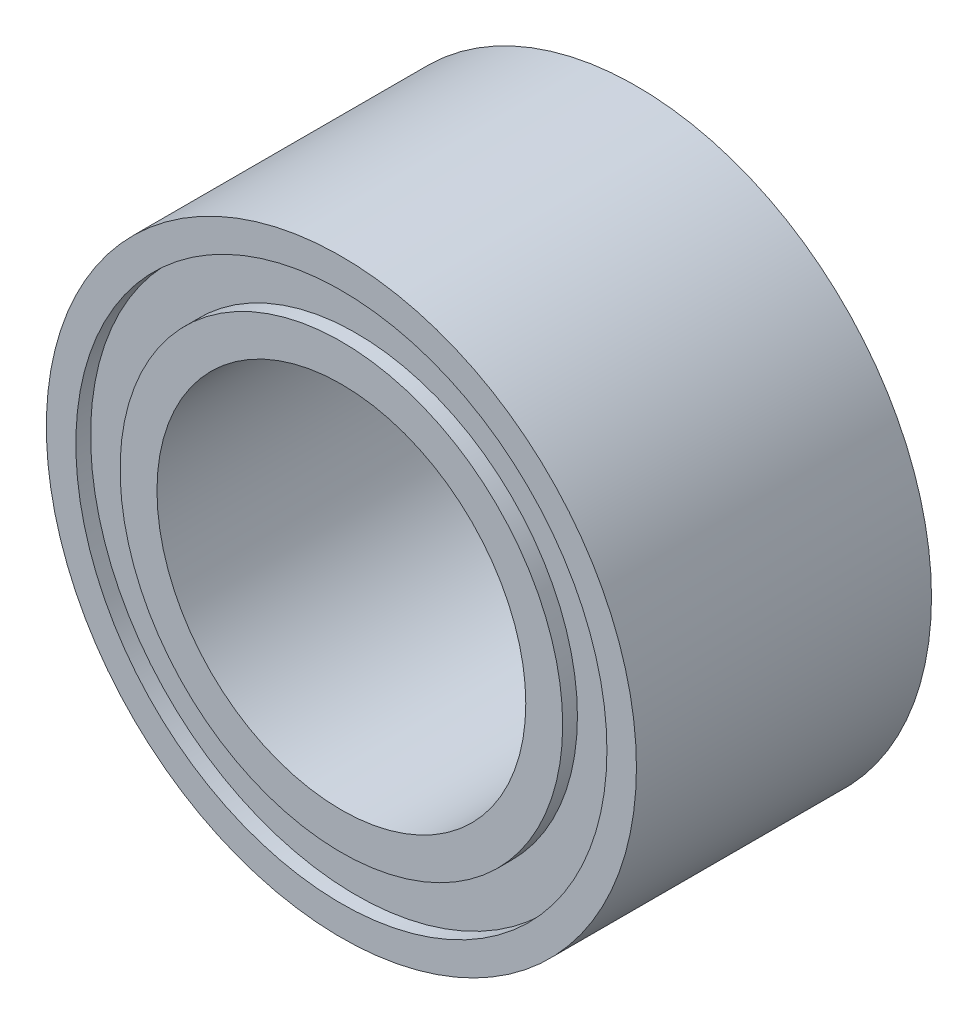
ISO-10303-21;
HEADER;
FILE_DESCRIPTION(('STEP AP214'),'2;1');
FILE_NAME('part.step','',(''),(''),'','','');
FILE_SCHEMA(('AUTOMOTIVE_DESIGN { 1 0 10303 214 1 1 1 1 }'));
ENDSEC;
DATA;
#1=APPLICATION_CONTEXT('core data for automotive mechanical design processes');
#2=APPLICATION_PROTOCOL_DEFINITION('international standard','automotive_design',2000,#1);
#3=PRODUCT_CONTEXT('',#1,'mechanical');
#4=PRODUCT('Part','Part','',(#3));
#5=PRODUCT_RELATED_PRODUCT_CATEGORY('part','',(#4));
#6=PRODUCT_DEFINITION_FORMATION('','',#4);
#7=PRODUCT_DEFINITION_CONTEXT('part definition',#1,'design');
#8=PRODUCT_DEFINITION('design','',#6,#7);
#9=PRODUCT_DEFINITION_SHAPE('','',#8);
#10=(LENGTH_UNIT() NAMED_UNIT(*) SI_UNIT(.MILLI.,.METRE.));
#11=(NAMED_UNIT(*) PLANE_ANGLE_UNIT() SI_UNIT($,.RADIAN.));
#12=(NAMED_UNIT(*) SI_UNIT($,.STERADIAN.) SOLID_ANGLE_UNIT());
#13=UNCERTAINTY_MEASURE_WITH_UNIT(LENGTH_MEASURE(1.E-05),#10,'distance_accuracy_value','');
#14=(GEOMETRIC_REPRESENTATION_CONTEXT(3) GLOBAL_UNCERTAINTY_ASSIGNED_CONTEXT((#13)) GLOBAL_UNIT_ASSIGNED_CONTEXT((#10,
#11,#12)) REPRESENTATION_CONTEXT('',''));
#15=CARTESIAN_POINT('',(0.,0.,0.));
#16=DIRECTION('',(0.,0.,1.));
#17=DIRECTION('',(1.,0.,0.));
#18=AXIS2_PLACEMENT_3D('',#15,#16,#17);
#19=CARTESIAN_POINT('',(0.,0.,0.));
#20=DIRECTION('',(0.,0.,1.));
#21=DIRECTION('',(1.,0.,0.));
#22=AXIS2_PLACEMENT_3D('',#19,#20,#21);
#23=PLANE('',#22);
#24=CARTESIAN_POINT('',(0.,0.,0.));
#25=DIRECTION('',(0.,0.,1.));
#26=DIRECTION('',(1.,0.,0.));
#27=AXIS2_PLACEMENT_3D('',#24,#25,#26);
#28=CIRCLE('',#27,3.175);
#29=CARTESIAN_POINT('',(3.175,0.,0.));
#30=VERTEX_POINT('',#29);
#31=EDGE_CURVE('E46',#30,#30,#28,.T.);
#32=ORIENTED_EDGE('',*,*,#31,.T.);
#33=EDGE_LOOP('',(#32));
#34=FACE_BOUND('',#33,.T.);
#35=CARTESIAN_POINT('',(0.,0.,0.));
#36=DIRECTION('',(0.,0.,1.));
#37=DIRECTION('',(1.,0.,0.));
#38=AXIS2_PLACEMENT_3D('',#35,#36,#37);
#39=CIRCLE('',#38,3.81);
#40=CARTESIAN_POINT('',(3.81,0.,0.));
#41=VERTEX_POINT('',#40);
#42=EDGE_CURVE('E70',#41,#41,#39,.T.);
#43=ORIENTED_EDGE('',*,*,#42,.F.);
#44=EDGE_LOOP('',(#43));
#45=FACE_BOUND('',#44,.T.);
#46=ADVANCED_FACE('F33',(#34,#45),#23,.F.);
#47=CARTESIAN_POINT('',(0.,0.,5.08));
#48=DIRECTION('',(0.,0.,1.));
#49=DIRECTION('',(1.,0.,0.));
#50=AXIS2_PLACEMENT_3D('',#47,#48,#49);
#51=PLANE('',#50);
#52=CARTESIAN_POINT('',(0.,0.,5.08));
#53=DIRECTION('',(0.,0.,1.));
#54=DIRECTION('',(1.,0.,0.));
#55=AXIS2_PLACEMENT_3D('',#52,#53,#54);
#56=CIRCLE('',#55,3.175);
#57=CARTESIAN_POINT('',(3.175,0.,5.08));
#58=VERTEX_POINT('',#57);
#59=EDGE_CURVE('E44',#58,#58,#56,.T.);
#60=ORIENTED_EDGE('',*,*,#59,.F.);
#61=EDGE_LOOP('',(#60));
#62=FACE_BOUND('',#61,.T.);
#63=CARTESIAN_POINT('',(0.,0.,5.08));
#64=DIRECTION('',(0.,0.,1.));
#65=DIRECTION('',(1.,0.,0.));
#66=AXIS2_PLACEMENT_3D('',#63,#64,#65);
#67=CIRCLE('',#66,3.81);
#68=CARTESIAN_POINT('',(3.81,0.,5.08));
#69=VERTEX_POINT('',#68);
#70=EDGE_CURVE('E58',#69,#69,#67,.T.);
#71=ORIENTED_EDGE('',*,*,#70,.T.);
#72=EDGE_LOOP('',(#71));
#73=FACE_BOUND('',#72,.T.);
#74=ADVANCED_FACE('F86',(#62,#73),#51,.T.);
#75=CARTESIAN_POINT('',(0.,0.,5.08));
#76=DIRECTION('',(0.,0.,1.));
#77=DIRECTION('',(1.,0.,0.));
#78=AXIS2_PLACEMENT_3D('',#75,#76,#77);
#79=CIRCLE('',#78,4.572);
#80=CARTESIAN_POINT('',(4.572,0.,5.08));
#81=VERTEX_POINT('',#80);
#82=EDGE_CURVE('E52',#81,#81,#79,.T.);
#83=ORIENTED_EDGE('',*,*,#82,.F.);
#84=EDGE_LOOP('',(#83));
#85=FACE_BOUND('',#84,.T.);
#86=CARTESIAN_POINT('',(0.,0.,5.08));
#87=DIRECTION('',(0.,0.,1.));
#88=DIRECTION('',(1.,0.,0.));
#89=AXIS2_PLACEMENT_3D('',#86,#87,#88);
#90=CIRCLE('',#89,5.08);
#91=CARTESIAN_POINT('',(5.08,0.,5.08));
#92=VERTEX_POINT('',#91);
#93=EDGE_CURVE('E10',#92,#92,#90,.T.);
#94=ORIENTED_EDGE('',*,*,#93,.T.);
#95=EDGE_LOOP('',(#94));
#96=FACE_BOUND('',#95,.T.);
#97=ADVANCED_FACE('F92',(#85,#96),#51,.T.);
#98=CARTESIAN_POINT('',(0.,0.,0.));
#99=DIRECTION('',(0.,0.,1.));
#100=DIRECTION('',(1.,0.,0.));
#101=AXIS2_PLACEMENT_3D('',#98,#99,#100);
#102=CIRCLE('',#101,4.572);
#103=CARTESIAN_POINT('',(4.572,0.,0.));
#104=VERTEX_POINT('',#103);
#105=EDGE_CURVE('E64',#104,#104,#102,.T.);
#106=ORIENTED_EDGE('',*,*,#105,.T.);
#107=EDGE_LOOP('',(#106));
#108=FACE_BOUND('',#107,.T.);
#109=CARTESIAN_POINT('',(0.,0.,0.));
#110=DIRECTION('',(0.,0.,1.));
#111=DIRECTION('',(1.,0.,0.));
#112=AXIS2_PLACEMENT_3D('',#109,#110,#111);
#113=CIRCLE('',#112,5.08);
#114=CARTESIAN_POINT('',(5.08,0.,0.));
#115=VERTEX_POINT('',#114);
#116=EDGE_CURVE('E37',#115,#115,#113,.T.);
#117=ORIENTED_EDGE('',*,*,#116,.F.);
#118=EDGE_LOOP('',(#117));
#119=FACE_BOUND('',#118,.T.);
#120=ADVANCED_FACE('F88',(#108,#119),#23,.F.);
#121=CARTESIAN_POINT('',(0.,0.,5.08));
#122=DIRECTION('',(0.,0.,-1.));
#123=DIRECTION('',(-1.,0.,0.));
#124=AXIS2_PLACEMENT_3D('',#121,#122,#123);
#125=CYLINDRICAL_SURFACE('',#124,5.08);
#126=ORIENTED_EDGE('',*,*,#93,.F.);
#127=EDGE_LOOP('',(#126));
#128=FACE_BOUND('',#127,.T.);
#129=ORIENTED_EDGE('',*,*,#116,.T.);
#130=EDGE_LOOP('',(#129));
#131=FACE_BOUND('',#130,.T.);
#132=ADVANCED_FACE('F35',(#128,#131),#125,.T.);
#133=CARTESIAN_POINT('',(0.,0.,5.08));
#134=DIRECTION('',(0.,0.,-1.));
#135=DIRECTION('',(-1.,0.,0.));
#136=AXIS2_PLACEMENT_3D('',#133,#134,#135);
#137=CYLINDRICAL_SURFACE('',#136,3.175);
#138=ORIENTED_EDGE('',*,*,#59,.T.);
#139=EDGE_LOOP('',(#138));
#140=FACE_BOUND('',#139,.T.);
#141=ORIENTED_EDGE('',*,*,#31,.F.);
#142=EDGE_LOOP('',(#141));
#143=FACE_BOUND('',#142,.T.);
#144=ADVANCED_FACE('F101',(#140,#143),#137,.F.);
#145=CARTESIAN_POINT('',(0.,0.,4.826));
#146=DIRECTION('',(0.,0.,1.));
#147=DIRECTION('',(1.,0.,0.));
#148=AXIS2_PLACEMENT_3D('',#145,#146,#147);
#149=CYLINDRICAL_SURFACE('',#148,4.572);
#150=CARTESIAN_POINT('',(0.,0.,4.826));
#151=DIRECTION('',(0.,0.,1.));
#152=DIRECTION('',(1.,0.,0.));
#153=AXIS2_PLACEMENT_3D('',#150,#151,#152);
#154=CIRCLE('',#153,4.572);
#155=CARTESIAN_POINT('',(4.572,0.,4.826));
#156=VERTEX_POINT('',#155);
#157=EDGE_CURVE('E49',#156,#156,#154,.T.);
#158=ORIENTED_EDGE('',*,*,#157,.F.);
#159=EDGE_LOOP('',(#158));
#160=FACE_BOUND('',#159,.T.);
#161=ORIENTED_EDGE('',*,*,#82,.T.);
#162=EDGE_LOOP('',(#161));
#163=FACE_BOUND('',#162,.T.);
#164=ADVANCED_FACE('F125',(#160,#163),#149,.F.);
#165=CARTESIAN_POINT('',(0.,0.,4.826));
#166=DIRECTION('',(0.,0.,1.));
#167=DIRECTION('',(1.,0.,0.));
#168=AXIS2_PLACEMENT_3D('',#165,#166,#167);
#169=PLANE('',#168);
#170=CARTESIAN_POINT('',(0.,0.,4.826));
#171=DIRECTION('',(0.,0.,1.));
#172=DIRECTION('',(1.,0.,0.));
#173=AXIS2_PLACEMENT_3D('',#170,#171,#172);
#174=CIRCLE('',#173,3.81);
#175=CARTESIAN_POINT('',(3.81,0.,4.826));
#176=VERTEX_POINT('',#175);
#177=EDGE_CURVE('E55',#176,#176,#174,.T.);
#178=ORIENTED_EDGE('',*,*,#177,.F.);
#179=EDGE_LOOP('',(#178));
#180=FACE_BOUND('',#179,.T.);
#181=ORIENTED_EDGE('',*,*,#157,.T.);
#182=EDGE_LOOP('',(#181));
#183=FACE_BOUND('',#182,.T.);
#184=ADVANCED_FACE('F121',(#180,#183),#169,.T.);
#185=CARTESIAN_POINT('',(0.,0.,4.826));
#186=DIRECTION('',(0.,0.,1.));
#187=DIRECTION('',(1.,0.,0.));
#188=AXIS2_PLACEMENT_3D('',#185,#186,#187);
#189=CYLINDRICAL_SURFACE('',#188,3.81);
#190=ORIENTED_EDGE('',*,*,#177,.T.);
#191=EDGE_LOOP('',(#190));
#192=FACE_BOUND('',#191,.T.);
#193=ORIENTED_EDGE('',*,*,#70,.F.);
#194=EDGE_LOOP('',(#193));
#195=FACE_BOUND('',#194,.T.);
#196=ADVANCED_FACE('F115',(#192,#195),#189,.T.);
#197=CARTESIAN_POINT('',(0.,0.,0.254));
#198=DIRECTION('',(0.,0.,-1.));
#199=DIRECTION('',(1.,0.,0.));
#200=AXIS2_PLACEMENT_3D('',#197,#198,#199);
#201=PLANE('',#200);
#202=CARTESIAN_POINT('',(0.,0.,0.254));
#203=DIRECTION('',(0.,0.,1.));
#204=DIRECTION('',(1.,0.,0.));
#205=AXIS2_PLACEMENT_3D('',#202,#203,#204);
#206=CIRCLE('',#205,4.572);
#207=CARTESIAN_POINT('',(4.572,0.,0.254));
#208=VERTEX_POINT('',#207);
#209=EDGE_CURVE('E61',#208,#208,#206,.T.);
#210=ORIENTED_EDGE('',*,*,#209,.F.);
#211=EDGE_LOOP('',(#210));
#212=FACE_BOUND('',#211,.T.);
#213=CARTESIAN_POINT('',(0.,0.,0.254));
#214=DIRECTION('',(0.,0.,1.));
#215=DIRECTION('',(1.,0.,0.));
#216=AXIS2_PLACEMENT_3D('',#213,#214,#215);
#217=CIRCLE('',#216,3.81);
#218=CARTESIAN_POINT('',(3.81,0.,0.254));
#219=VERTEX_POINT('',#218);
#220=EDGE_CURVE('E67',#219,#219,#217,.T.);
#221=ORIENTED_EDGE('',*,*,#220,.T.);
#222=EDGE_LOOP('',(#221));
#223=FACE_BOUND('',#222,.T.);
#224=ADVANCED_FACE('F76',(#212,#223),#201,.T.);
#225=CARTESIAN_POINT('',(0.,0.,0.254));
#226=DIRECTION('',(0.,0.,-1.));
#227=DIRECTION('',(-1.,0.,0.));
#228=AXIS2_PLACEMENT_3D('',#225,#226,#227);
#229=CYLINDRICAL_SURFACE('',#228,4.572);
#230=ORIENTED_EDGE('',*,*,#209,.T.);
#231=EDGE_LOOP('',(#230));
#232=FACE_BOUND('',#231,.T.);
#233=ORIENTED_EDGE('',*,*,#105,.F.);
#234=EDGE_LOOP('',(#233));
#235=FACE_BOUND('',#234,.T.);
#236=ADVANCED_FACE('F81',(#232,#235),#229,.F.);
#237=CARTESIAN_POINT('',(0.,0.,0.254));
#238=DIRECTION('',(0.,0.,-1.));
#239=DIRECTION('',(-1.,0.,0.));
#240=AXIS2_PLACEMENT_3D('',#237,#238,#239);
#241=CYLINDRICAL_SURFACE('',#240,3.81);
#242=ORIENTED_EDGE('',*,*,#220,.F.);
#243=EDGE_LOOP('',(#242));
#244=FACE_BOUND('',#243,.T.);
#245=ORIENTED_EDGE('',*,*,#42,.T.);
#246=EDGE_LOOP('',(#245));
#247=FACE_BOUND('',#246,.T.);
#248=ADVANCED_FACE('F78',(#244,#247),#241,.T.);
#249=CLOSED_SHELL('',(#46,#74,#97,#120,#132,#144,#164,#184,#196,#224,#236,#248));
#250=MANIFOLD_SOLID_BREP('B2',#249);
#251=ADVANCED_BREP_SHAPE_REPRESENTATION('',(#18,#250),#14);
#252=SHAPE_DEFINITION_REPRESENTATION(#9,#251);
ENDSEC;
END-ISO-10303-21;
